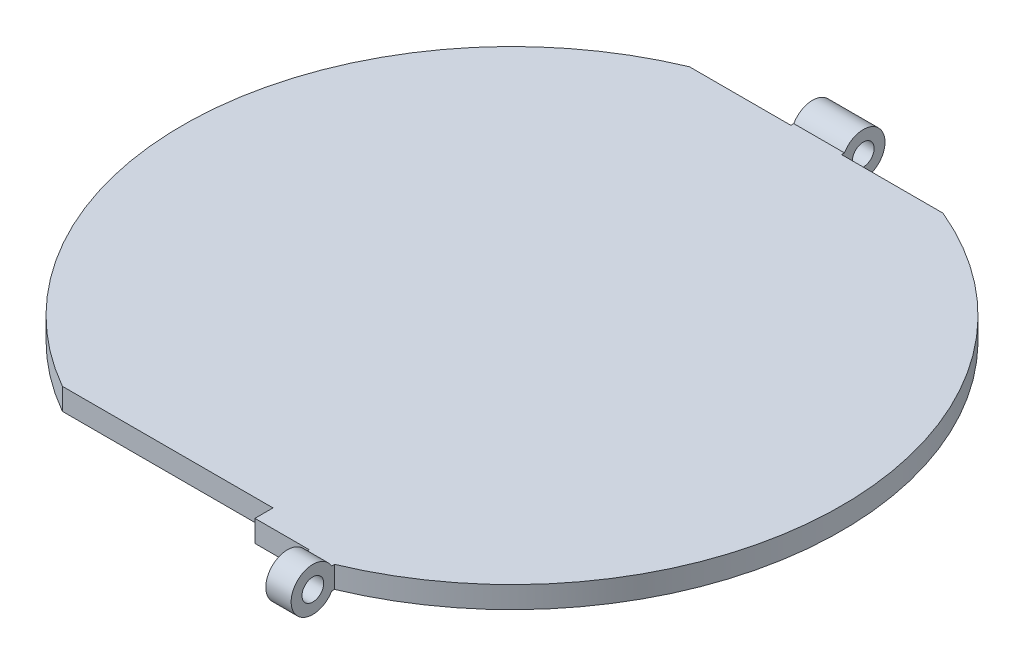
ISO-10303-21;
HEADER;
FILE_DESCRIPTION(('STEP AP214'),'2;1');
FILE_NAME('part.step','',(''),(''),'','','');
FILE_SCHEMA(('AUTOMOTIVE_DESIGN { 1 0 10303 214 1 1 1 1 }'));
ENDSEC;
DATA;
#1=APPLICATION_CONTEXT('core data for automotive mechanical design processes');
#2=APPLICATION_PROTOCOL_DEFINITION('international standard','automotive_design',2000,#1);
#3=PRODUCT_CONTEXT('',#1,'mechanical');
#4=PRODUCT('Part','Part','',(#3));
#5=PRODUCT_RELATED_PRODUCT_CATEGORY('part','',(#4));
#6=PRODUCT_DEFINITION_FORMATION('','',#4);
#7=PRODUCT_DEFINITION_CONTEXT('part definition',#1,'design');
#8=PRODUCT_DEFINITION('design','',#6,#7);
#9=PRODUCT_DEFINITION_SHAPE('','',#8);
#10=(LENGTH_UNIT() NAMED_UNIT(*) SI_UNIT(.MILLI.,.METRE.));
#11=(NAMED_UNIT(*) PLANE_ANGLE_UNIT() SI_UNIT($,.RADIAN.));
#12=(NAMED_UNIT(*) SI_UNIT($,.STERADIAN.) SOLID_ANGLE_UNIT());
#13=UNCERTAINTY_MEASURE_WITH_UNIT(LENGTH_MEASURE(1.E-05),#10,'distance_accuracy_value','');
#14=(GEOMETRIC_REPRESENTATION_CONTEXT(3) GLOBAL_UNCERTAINTY_ASSIGNED_CONTEXT((#13)) GLOBAL_UNIT_ASSIGNED_CONTEXT((#10,
#11,#12)) REPRESENTATION_CONTEXT('',''));
#15=CARTESIAN_POINT('',(0.,0.,0.));
#16=DIRECTION('',(0.,0.,1.));
#17=DIRECTION('',(1.,0.,0.));
#18=AXIS2_PLACEMENT_3D('',#15,#16,#17);
#19=CARTESIAN_POINT('',(0.,3.,0.));
#20=DIRECTION('',(0.,-1.,0.));
#21=DIRECTION('',(0.,0.,-1.));
#22=AXIS2_PLACEMENT_3D('',#19,#20,#21);
#23=CYLINDRICAL_SURFACE('',#22,45.5);
#24=DIRECTION('',(0.,-1.,0.));
#25=VECTOR('',#24,1.);
#26=CARTESIAN_POINT('',(-22.5831795812724,3.,39.5));
#27=LINE('',#26,#25);
#28=CARTESIAN_POINT('',(-22.5831795812724,0.,39.5));
#29=VERTEX_POINT('',#28);
#30=CARTESIAN_POINT('',(-22.5831795812724,3.,39.5));
#31=VERTEX_POINT('',#30);
#32=EDGE_CURVE('E51',#29,#31,#27,.F.);
#33=ORIENTED_EDGE('',*,*,#32,.T.);
#34=CARTESIAN_POINT('',(0.,3.,0.));
#35=DIRECTION('',(0.,1.,0.));
#36=DIRECTION('',(0.,0.,1.));
#37=AXIS2_PLACEMENT_3D('',#34,#35,#36);
#38=CIRCLE('',#37,45.5);
#39=CARTESIAN_POINT('',(-17.5,3.,-42.));
#40=VERTEX_POINT('',#39);
#41=EDGE_CURVE('E143',#40,#31,#38,.T.);
#42=ORIENTED_EDGE('',*,*,#41,.F.);
#43=DIRECTION('',(0.,-1.,0.));
#44=VECTOR('',#43,1.);
#45=CARTESIAN_POINT('',(-17.5,3.,-42.));
#46=LINE('',#45,#44);
#47=CARTESIAN_POINT('',(-17.5,0.,-42.));
#48=VERTEX_POINT('',#47);
#49=EDGE_CURVE('E164',#40,#48,#46,.T.);
#50=ORIENTED_EDGE('',*,*,#49,.T.);
#51=CARTESIAN_POINT('',(0.,0.,0.));
#52=DIRECTION('',(0.,1.,0.));
#53=DIRECTION('',(0.,0.,1.));
#54=AXIS2_PLACEMENT_3D('',#51,#52,#53);
#55=CIRCLE('',#54,45.5);
#56=EDGE_CURVE('E145',#48,#29,#55,.T.);
#57=ORIENTED_EDGE('',*,*,#56,.T.);
#58=EDGE_LOOP('',(#33,#42,#50,#57));
#59=FACE_BOUND('',#58,.T.);
#60=ADVANCED_FACE('F37',(#59),#23,.T.);
#61=CARTESIAN_POINT('',(-17.5,3.,42.));
#62=DIRECTION('',(0.,0.,-1.));
#63=DIRECTION('',(-1.,0.,0.));
#64=AXIS2_PLACEMENT_3D('',#61,#62,#63);
#65=PLANE('',#64);
#66=DIRECTION('',(0.,1.,0.));
#67=VECTOR('',#66,1.);
#68=CARTESIAN_POINT('',(6.5,3.,42.));
#69=LINE('',#68,#67);
#70=CARTESIAN_POINT('',(6.5,0.,42.));
#71=VERTEX_POINT('',#70);
#72=CARTESIAN_POINT('',(6.5,3.,42.));
#73=VERTEX_POINT('',#72);
#74=EDGE_CURVE('E137',#71,#73,#69,.T.);
#75=ORIENTED_EDGE('',*,*,#74,.F.);
#76=DIRECTION('',(1.,0.,0.));
#77=VECTOR('',#76,1.);
#78=CARTESIAN_POINT('',(-17.5,0.,42.));
#79=LINE('',#78,#77);
#80=CARTESIAN_POINT('',(14.,0.,42.));
#81=VERTEX_POINT('',#80);
#82=EDGE_CURVE('E166',#71,#81,#79,.T.);
#83=ORIENTED_EDGE('',*,*,#82,.T.);
#84=DIRECTION('',(0.,-1.,0.));
#85=VECTOR('',#84,1.);
#86=CARTESIAN_POINT('',(14.,6.5,42.));
#87=LINE('',#86,#85);
#88=CARTESIAN_POINT('',(14.,3.,42.));
#89=VERTEX_POINT('',#88);
#90=EDGE_CURVE('E182',#89,#81,#87,.T.);
#91=ORIENTED_EDGE('',*,*,#90,.F.);
#92=DIRECTION('',(1.,0.,0.));
#93=VECTOR('',#92,1.);
#94=CARTESIAN_POINT('',(-17.5,3.,42.));
#95=LINE('',#94,#93);
#96=EDGE_CURVE('E150',#73,#89,#95,.T.);
#97=ORIENTED_EDGE('',*,*,#96,.F.);
#98=EDGE_LOOP('',(#75,#83,#91,#97));
#99=FACE_BOUND('',#98,.T.);
#100=ADVANCED_FACE('F203',(#99),#65,.F.);
#101=CARTESIAN_POINT('',(0.,3.,0.));
#102=DIRECTION('',(0.,1.,0.));
#103=DIRECTION('',(0.,0.,1.));
#104=AXIS2_PLACEMENT_3D('',#101,#102,#103);
#105=PLANE('',#104);
#106=DIRECTION('',(1.,0.,0.));
#107=VECTOR('',#106,1.);
#108=CARTESIAN_POINT('',(0.,3.,39.5));
#109=LINE('',#108,#107);
#110=CARTESIAN_POINT('',(6.5,3.,39.5));
#111=VERTEX_POINT('',#110);
#112=EDGE_CURVE('E130',#31,#111,#109,.T.);
#113=ORIENTED_EDGE('',*,*,#112,.T.);
#114=DIRECTION('',(0.,0.,1.));
#115=VECTOR('',#114,1.);
#116=CARTESIAN_POINT('',(6.5,3.,0.));
#117=LINE('',#116,#115);
#118=EDGE_CURVE('E193',#111,#73,#117,.T.);
#119=ORIENTED_EDGE('',*,*,#118,.T.);
#120=ORIENTED_EDGE('',*,*,#96,.T.);
#121=DIRECTION('',(0.,0.,1.));
#122=VECTOR('',#121,1.);
#123=CARTESIAN_POINT('',(14.,3.,0.));
#124=LINE('',#123,#122);
#125=CARTESIAN_POINT('',(14.,3.,42.4019237886467));
#126=VERTEX_POINT('',#125);
#127=EDGE_CURVE('E211',#89,#126,#124,.T.);
#128=ORIENTED_EDGE('',*,*,#127,.T.);
#129=DIRECTION('',(1.,0.,0.));
#130=VECTOR('',#129,1.);
#131=CARTESIAN_POINT('',(-10.,3.,42.4019237886467));
#132=LINE('',#131,#130);
#133=CARTESIAN_POINT('',(17.5,3.,42.4019237886467));
#134=VERTEX_POINT('',#133);
#135=EDGE_CURVE('E158',#126,#134,#132,.T.);
#136=ORIENTED_EDGE('',*,*,#135,.T.);
#137=DIRECTION('',(0.,0.,1.));
#138=VECTOR('',#137,1.);
#139=CARTESIAN_POINT('',(17.5,3.,42.));
#140=LINE('',#139,#138);
#141=CARTESIAN_POINT('',(17.5,3.,42.));
#142=VERTEX_POINT('',#141);
#143=EDGE_CURVE('E229',#142,#134,#140,.T.);
#144=ORIENTED_EDGE('',*,*,#143,.F.);
#145=CARTESIAN_POINT('',(0.,3.,0.));
#146=DIRECTION('',(0.,1.,0.));
#147=DIRECTION('',(0.,0.,1.));
#148=AXIS2_PLACEMENT_3D('',#145,#146,#147);
#149=CIRCLE('',#148,45.5);
#150=CARTESIAN_POINT('',(17.5,3.,-42.));
#151=VERTEX_POINT('',#150);
#152=EDGE_CURVE('E153',#142,#151,#149,.T.);
#153=ORIENTED_EDGE('',*,*,#152,.T.);
#154=DIRECTION('',(1.,0.,0.));
#155=VECTOR('',#154,1.);
#156=CARTESIAN_POINT('',(0.,3.,-42.));
#157=LINE('',#156,#155);
#158=CARTESIAN_POINT('',(3.5,3.,-42.));
#159=VERTEX_POINT('',#158);
#160=EDGE_CURVE('E468',#159,#151,#157,.T.);
#161=ORIENTED_EDGE('',*,*,#160,.F.);
#162=DIRECTION('',(0.,0.,-1.));
#163=VECTOR('',#162,1.);
#164=CARTESIAN_POINT('',(3.5,3.,0.));
#165=LINE('',#164,#163);
#166=CARTESIAN_POINT('',(3.5,3.,-42.4019237886467));
#167=VERTEX_POINT('',#166);
#168=EDGE_CURVE('E457',#159,#167,#165,.T.);
#169=ORIENTED_EDGE('',*,*,#168,.T.);
#170=DIRECTION('',(1.,0.,0.));
#171=VECTOR('',#170,1.);
#172=CARTESIAN_POINT('',(-10.,3.,-42.4019237886467));
#173=LINE('',#172,#171);
#174=CARTESIAN_POINT('',(-3.5,3.,-42.4019237886467));
#175=VERTEX_POINT('',#174);
#176=EDGE_CURVE('E221',#175,#167,#173,.T.);
#177=ORIENTED_EDGE('',*,*,#176,.F.);
#178=DIRECTION('',(0.,0.,1.));
#179=VECTOR('',#178,1.);
#180=CARTESIAN_POINT('',(-3.5,3.,0.));
#181=LINE('',#180,#179);
#182=CARTESIAN_POINT('',(-3.5,3.,-42.));
#183=VERTEX_POINT('',#182);
#184=EDGE_CURVE('E59',#175,#183,#181,.T.);
#185=ORIENTED_EDGE('',*,*,#184,.T.);
#186=DIRECTION('',(-1.,0.,0.));
#187=VECTOR('',#186,1.);
#188=CARTESIAN_POINT('',(-17.5,3.,-42.));
#189=LINE('',#188,#187);
#190=EDGE_CURVE('E148',#183,#40,#189,.T.);
#191=ORIENTED_EDGE('',*,*,#190,.T.);
#192=ORIENTED_EDGE('',*,*,#41,.T.);
#193=EDGE_LOOP('',(#113,#119,#120,#128,#136,#144,#153,#161,#169,#177,#185,#191,#192));
#194=FACE_BOUND('',#193,.T.);
#195=ADVANCED_FACE('F147',(#194),#105,.T.);
#196=CARTESIAN_POINT('',(0.,0.,0.));
#197=DIRECTION('',(0.,1.,0.));
#198=DIRECTION('',(0.,0.,1.));
#199=AXIS2_PLACEMENT_3D('',#196,#197,#198);
#200=PLANE('',#199);
#201=DIRECTION('',(0.,0.,1.));
#202=VECTOR('',#201,1.);
#203=CARTESIAN_POINT('',(6.5,0.,0.));
#204=LINE('',#203,#202);
#205=CARTESIAN_POINT('',(6.5,0.,39.5));
#206=VERTEX_POINT('',#205);
#207=EDGE_CURVE('E11',#206,#71,#204,.T.);
#208=ORIENTED_EDGE('',*,*,#207,.F.);
#209=DIRECTION('',(1.,0.,0.));
#210=VECTOR('',#209,1.);
#211=CARTESIAN_POINT('',(0.,0.,39.5));
#212=LINE('',#211,#210);
#213=EDGE_CURVE('E44',#29,#206,#212,.T.);
#214=ORIENTED_EDGE('',*,*,#213,.F.);
#215=ORIENTED_EDGE('',*,*,#56,.F.);
#216=DIRECTION('',(-1.,0.,0.));
#217=VECTOR('',#216,1.);
#218=CARTESIAN_POINT('',(-17.5,0.,-42.));
#219=LINE('',#218,#217);
#220=CARTESIAN_POINT('',(-3.5,0.,-42.));
#221=VERTEX_POINT('',#220);
#222=EDGE_CURVE('E151',#221,#48,#219,.T.);
#223=ORIENTED_EDGE('',*,*,#222,.F.);
#224=DIRECTION('',(0.,0.,1.));
#225=VECTOR('',#224,1.);
#226=CARTESIAN_POINT('',(-3.5,0.,0.));
#227=LINE('',#226,#225);
#228=CARTESIAN_POINT('',(-3.5,0.,-42.4019237886467));
#229=VERTEX_POINT('',#228);
#230=EDGE_CURVE('E213',#229,#221,#227,.T.);
#231=ORIENTED_EDGE('',*,*,#230,.F.);
#232=DIRECTION('',(1.,0.,0.));
#233=VECTOR('',#232,1.);
#234=CARTESIAN_POINT('',(-10.,0.,-42.4019237886467));
#235=LINE('',#234,#233);
#236=CARTESIAN_POINT('',(3.5,0.,-42.4019237886467));
#237=VERTEX_POINT('',#236);
#238=EDGE_CURVE('E220',#229,#237,#235,.T.);
#239=ORIENTED_EDGE('',*,*,#238,.T.);
#240=DIRECTION('',(0.,0.,-1.));
#241=VECTOR('',#240,1.);
#242=CARTESIAN_POINT('',(3.5,0.,0.));
#243=LINE('',#242,#241);
#244=CARTESIAN_POINT('',(3.5,0.,-42.));
#245=VERTEX_POINT('',#244);
#246=EDGE_CURVE('E177',#245,#237,#243,.T.);
#247=ORIENTED_EDGE('',*,*,#246,.F.);
#248=DIRECTION('',(1.,0.,0.));
#249=VECTOR('',#248,1.);
#250=CARTESIAN_POINT('',(0.,0.,-42.));
#251=LINE('',#250,#249);
#252=CARTESIAN_POINT('',(17.5,0.,-42.));
#253=VERTEX_POINT('',#252);
#254=EDGE_CURVE('E459',#245,#253,#251,.T.);
#255=ORIENTED_EDGE('',*,*,#254,.T.);
#256=CARTESIAN_POINT('',(0.,0.,0.));
#257=DIRECTION('',(0.,1.,0.));
#258=DIRECTION('',(0.,0.,1.));
#259=AXIS2_PLACEMENT_3D('',#256,#257,#258);
#260=CIRCLE('',#259,45.5);
#261=CARTESIAN_POINT('',(17.5,0.,42.));
#262=VERTEX_POINT('',#261);
#263=EDGE_CURVE('E155',#262,#253,#260,.T.);
#264=ORIENTED_EDGE('',*,*,#263,.F.);
#265=DIRECTION('',(0.,0.,-1.));
#266=VECTOR('',#265,1.);
#267=CARTESIAN_POINT('',(17.5,0.,42.));
#268=LINE('',#267,#266);
#269=CARTESIAN_POINT('',(17.5,0.,42.4019237886467));
#270=VERTEX_POINT('',#269);
#271=EDGE_CURVE('E235',#270,#262,#268,.T.);
#272=ORIENTED_EDGE('',*,*,#271,.F.);
#273=DIRECTION('',(1.,0.,0.));
#274=VECTOR('',#273,1.);
#275=CARTESIAN_POINT('',(-10.,0.,42.4019237886467));
#276=LINE('',#275,#274);
#277=CARTESIAN_POINT('',(14.,0.,42.4019237886467));
#278=VERTEX_POINT('',#277);
#279=EDGE_CURVE('E167',#278,#270,#276,.T.);
#280=ORIENTED_EDGE('',*,*,#279,.F.);
#281=DIRECTION('',(0.,0.,1.));
#282=VECTOR('',#281,1.);
#283=CARTESIAN_POINT('',(14.,0.,0.));
#284=LINE('',#283,#282);
#285=EDGE_CURVE('E199',#81,#278,#284,.T.);
#286=ORIENTED_EDGE('',*,*,#285,.F.);
#287=ORIENTED_EDGE('',*,*,#82,.F.);
#288=EDGE_LOOP('',(#208,#214,#215,#223,#231,#239,#247,#255,#264,#272,#280,#286,#287));
#289=FACE_BOUND('',#288,.T.);
#290=ADVANCED_FACE('F196',(#289),#200,.F.);
#291=CARTESIAN_POINT('',(-10.,1.5,-45.));
#292=DIRECTION('',(1.,0.,0.));
#293=DIRECTION('',(0.,0.,-1.));
#294=AXIS2_PLACEMENT_3D('',#291,#292,#293);
#295=CYLINDRICAL_SURFACE('',#294,3.);
#296=CARTESIAN_POINT('',(3.5,1.5,-45.));
#297=DIRECTION('',(1.,0.,0.));
#298=DIRECTION('',(0.,0.,-1.));
#299=AXIS2_PLACEMENT_3D('',#296,#297,#298);
#300=CIRCLE('',#299,3.);
#301=EDGE_CURVE('E467',#237,#167,#300,.T.);
#302=ORIENTED_EDGE('',*,*,#301,.F.);
#303=ORIENTED_EDGE('',*,*,#238,.F.);
#304=CARTESIAN_POINT('',(-3.5,1.5,-45.));
#305=DIRECTION('',(-1.,0.,0.));
#306=DIRECTION('',(0.,0.,1.));
#307=AXIS2_PLACEMENT_3D('',#304,#305,#306);
#308=CIRCLE('',#307,3.);
#309=EDGE_CURVE('E186',#175,#229,#308,.T.);
#310=ORIENTED_EDGE('',*,*,#309,.F.);
#311=ORIENTED_EDGE('',*,*,#176,.T.);
#312=EDGE_LOOP('',(#302,#303,#310,#311));
#313=FACE_BOUND('',#312,.T.);
#314=ADVANCED_FACE('F257',(#313),#295,.T.);
#315=CARTESIAN_POINT('',(-10.,1.5,-45.));
#316=DIRECTION('',(1.,0.,0.));
#317=DIRECTION('',(0.,0.,-1.));
#318=AXIS2_PLACEMENT_3D('',#315,#316,#317);
#319=CYLINDRICAL_SURFACE('',#318,1.5);
#320=CARTESIAN_POINT('',(-3.5,1.5,-45.));
#321=DIRECTION('',(-1.,0.,0.));
#322=DIRECTION('',(0.,0.,1.));
#323=AXIS2_PLACEMENT_3D('',#320,#321,#322);
#324=CIRCLE('',#323,1.5);
#325=CARTESIAN_POINT('',(-3.5,1.5,-43.5));
#326=VERTEX_POINT('',#325);
#327=EDGE_CURVE('E183',#326,#326,#324,.T.);
#328=ORIENTED_EDGE('',*,*,#327,.T.);
#329=EDGE_LOOP('',(#328));
#330=FACE_BOUND('',#329,.T.);
#331=CARTESIAN_POINT('',(3.5,1.5,-45.));
#332=DIRECTION('',(1.,0.,0.));
#333=DIRECTION('',(0.,0.,-1.));
#334=AXIS2_PLACEMENT_3D('',#331,#332,#333);
#335=CIRCLE('',#334,1.5);
#336=CARTESIAN_POINT('',(3.5,1.5,-46.5));
#337=VERTEX_POINT('',#336);
#338=EDGE_CURVE('E451',#337,#337,#335,.T.);
#339=ORIENTED_EDGE('',*,*,#338,.T.);
#340=EDGE_LOOP('',(#339));
#341=FACE_BOUND('',#340,.T.);
#342=ADVANCED_FACE('F248',(#330,#341),#319,.F.);
#343=CARTESIAN_POINT('',(-10.,1.5,45.));
#344=DIRECTION('',(1.,0.,0.));
#345=DIRECTION('',(0.,0.,-1.));
#346=AXIS2_PLACEMENT_3D('',#343,#344,#345);
#347=CYLINDRICAL_SURFACE('',#346,3.);
#348=ORIENTED_EDGE('',*,*,#135,.F.);
#349=CARTESIAN_POINT('',(14.,1.5,45.));
#350=DIRECTION('',(-1.,0.,0.));
#351=DIRECTION('',(0.,0.,1.));
#352=AXIS2_PLACEMENT_3D('',#349,#350,#351);
#353=CIRCLE('',#352,3.);
#354=EDGE_CURVE('E181',#126,#278,#353,.F.);
#355=ORIENTED_EDGE('',*,*,#354,.T.);
#356=ORIENTED_EDGE('',*,*,#279,.T.);
#357=CARTESIAN_POINT('',(17.5,1.5,45.));
#358=DIRECTION('',(1.,0.,0.));
#359=DIRECTION('',(0.,0.,-1.));
#360=AXIS2_PLACEMENT_3D('',#357,#358,#359);
#361=CIRCLE('',#360,3.);
#362=EDGE_CURVE('E232',#134,#270,#361,.T.);
#363=ORIENTED_EDGE('',*,*,#362,.F.);
#364=EDGE_LOOP('',(#348,#355,#356,#363));
#365=FACE_BOUND('',#364,.T.);
#366=ADVANCED_FACE('F245',(#365),#347,.T.);
#367=CARTESIAN_POINT('',(-10.,1.5,45.));
#368=DIRECTION('',(1.,0.,0.));
#369=DIRECTION('',(0.,0.,-1.));
#370=AXIS2_PLACEMENT_3D('',#367,#368,#369);
#371=CYLINDRICAL_SURFACE('',#370,1.5);
#372=CARTESIAN_POINT('',(17.5,1.5,45.));
#373=DIRECTION('',(1.,0.,0.));
#374=DIRECTION('',(0.,0.,-1.));
#375=AXIS2_PLACEMENT_3D('',#372,#373,#374);
#376=CIRCLE('',#375,1.5);
#377=CARTESIAN_POINT('',(17.5,1.5,43.5));
#378=VERTEX_POINT('',#377);
#379=EDGE_CURVE('E224',#378,#378,#376,.T.);
#380=ORIENTED_EDGE('',*,*,#379,.T.);
#381=EDGE_LOOP('',(#380));
#382=FACE_BOUND('',#381,.T.);
#383=CARTESIAN_POINT('',(14.,1.5,45.));
#384=DIRECTION('',(-1.,0.,0.));
#385=DIRECTION('',(0.,0.,1.));
#386=AXIS2_PLACEMENT_3D('',#383,#384,#385);
#387=CIRCLE('',#386,1.5);
#388=CARTESIAN_POINT('',(14.,1.5,46.5));
#389=VERTEX_POINT('',#388);
#390=EDGE_CURVE('E178',#389,#389,#387,.F.);
#391=ORIENTED_EDGE('',*,*,#390,.F.);
#392=EDGE_LOOP('',(#391));
#393=FACE_BOUND('',#392,.T.);
#394=ADVANCED_FACE('F247',(#382,#393),#371,.F.);
#395=CARTESIAN_POINT('',(-17.5,3.,-42.));
#396=DIRECTION('',(0.,0.,1.));
#397=DIRECTION('',(1.,0.,0.));
#398=AXIS2_PLACEMENT_3D('',#395,#396,#397);
#399=PLANE('',#398);
#400=ORIENTED_EDGE('',*,*,#190,.F.);
#401=DIRECTION('',(0.,1.,0.));
#402=VECTOR('',#401,1.);
#403=CARTESIAN_POINT('',(-3.5,-2.5,-42.));
#404=LINE('',#403,#402);
#405=EDGE_CURVE('E187',#221,#183,#404,.T.);
#406=ORIENTED_EDGE('',*,*,#405,.F.);
#407=ORIENTED_EDGE('',*,*,#222,.T.);
#408=ORIENTED_EDGE('',*,*,#49,.F.);
#409=EDGE_LOOP('',(#400,#406,#407,#408));
#410=FACE_BOUND('',#409,.T.);
#411=ADVANCED_FACE('F254',(#410),#399,.F.);
#412=CARTESIAN_POINT('',(0.,3.,0.));
#413=DIRECTION('',(0.,-1.,0.));
#414=DIRECTION('',(0.,0.,-1.));
#415=AXIS2_PLACEMENT_3D('',#412,#413,#414);
#416=CYLINDRICAL_SURFACE('',#415,45.5);
#417=ORIENTED_EDGE('',*,*,#263,.T.);
#418=DIRECTION('',(0.,-1.,0.));
#419=VECTOR('',#418,1.);
#420=CARTESIAN_POINT('',(17.5,3.,-42.));
#421=LINE('',#420,#419);
#422=EDGE_CURVE('E172',#151,#253,#421,.T.);
#423=ORIENTED_EDGE('',*,*,#422,.F.);
#424=ORIENTED_EDGE('',*,*,#152,.F.);
#425=DIRECTION('',(0.,-1.,0.));
#426=VECTOR('',#425,1.);
#427=CARTESIAN_POINT('',(17.5,3.,42.));
#428=LINE('',#427,#426);
#429=EDGE_CURVE('E174',#142,#262,#428,.T.);
#430=ORIENTED_EDGE('',*,*,#429,.T.);
#431=EDGE_LOOP('',(#417,#423,#424,#430));
#432=FACE_BOUND('',#431,.T.);
#433=ADVANCED_FACE('F271',(#432),#416,.T.);
#434=CARTESIAN_POINT('',(17.5,1.5,45.));
#435=DIRECTION('',(1.,0.,0.));
#436=DIRECTION('',(0.,0.,-1.));
#437=AXIS2_PLACEMENT_3D('',#434,#435,#436);
#438=PLANE('',#437);
#439=ORIENTED_EDGE('',*,*,#429,.F.);
#440=ORIENTED_EDGE('',*,*,#143,.T.);
#441=ORIENTED_EDGE('',*,*,#362,.T.);
#442=ORIENTED_EDGE('',*,*,#271,.T.);
#443=EDGE_LOOP('',(#439,#440,#441,#442));
#444=FACE_BOUND('',#443,.T.);
#445=ORIENTED_EDGE('',*,*,#379,.F.);
#446=EDGE_LOOP('',(#445));
#447=FACE_BOUND('',#446,.T.);
#448=ADVANCED_FACE('F242',(#444,#447),#438,.T.);
#449=CARTESIAN_POINT('',(14.,0.,0.));
#450=DIRECTION('',(-1.,0.,0.));
#451=DIRECTION('',(0.,0.,1.));
#452=AXIS2_PLACEMENT_3D('',#449,#450,#451);
#453=PLANE('',#452);
#454=ORIENTED_EDGE('',*,*,#90,.T.);
#455=ORIENTED_EDGE('',*,*,#285,.T.);
#456=ORIENTED_EDGE('',*,*,#354,.F.);
#457=ORIENTED_EDGE('',*,*,#127,.F.);
#458=EDGE_LOOP('',(#454,#455,#456,#457));
#459=FACE_BOUND('',#458,.T.);
#460=ORIENTED_EDGE('',*,*,#390,.T.);
#461=EDGE_LOOP('',(#460));
#462=FACE_BOUND('',#461,.T.);
#463=ADVANCED_FACE('F207',(#459,#462),#453,.T.);
#464=CARTESIAN_POINT('',(-3.5,0.,0.));
#465=DIRECTION('',(-1.,0.,0.));
#466=DIRECTION('',(0.,0.,1.));
#467=AXIS2_PLACEMENT_3D('',#464,#465,#466);
#468=PLANE('',#467);
#469=ORIENTED_EDGE('',*,*,#309,.T.);
#470=ORIENTED_EDGE('',*,*,#230,.T.);
#471=ORIENTED_EDGE('',*,*,#405,.T.);
#472=ORIENTED_EDGE('',*,*,#184,.F.);
#473=EDGE_LOOP('',(#469,#470,#471,#472));
#474=FACE_BOUND('',#473,.T.);
#475=ORIENTED_EDGE('',*,*,#327,.F.);
#476=EDGE_LOOP('',(#475));
#477=FACE_BOUND('',#476,.T.);
#478=ADVANCED_FACE('F293',(#474,#477),#468,.T.);
#479=CARTESIAN_POINT('',(3.5,5.08958026071778,-42.));
#480=DIRECTION('',(0.,0.,1.));
#481=DIRECTION('',(1.,0.,0.));
#482=AXIS2_PLACEMENT_3D('',#479,#480,#481);
#483=PLANE('',#482);
#484=ORIENTED_EDGE('',*,*,#160,.T.);
#485=ORIENTED_EDGE('',*,*,#422,.T.);
#486=ORIENTED_EDGE('',*,*,#254,.F.);
#487=DIRECTION('',(0.,-1.,0.));
#488=VECTOR('',#487,1.);
#489=CARTESIAN_POINT('',(3.5,5.08958026071778,-42.));
#490=LINE('',#489,#488);
#491=EDGE_CURVE('E454',#159,#245,#490,.T.);
#492=ORIENTED_EDGE('',*,*,#491,.F.);
#493=EDGE_LOOP('',(#484,#485,#486,#492));
#494=FACE_BOUND('',#493,.T.);
#495=ADVANCED_FACE('F297',(#494),#483,.F.);
#496=CARTESIAN_POINT('',(3.5,0.,0.));
#497=DIRECTION('',(1.,0.,0.));
#498=DIRECTION('',(0.,0.,-1.));
#499=AXIS2_PLACEMENT_3D('',#496,#497,#498);
#500=PLANE('',#499);
#501=ORIENTED_EDGE('',*,*,#338,.F.);
#502=EDGE_LOOP('',(#501));
#503=FACE_BOUND('',#502,.T.);
#504=ORIENTED_EDGE('',*,*,#491,.T.);
#505=ORIENTED_EDGE('',*,*,#246,.T.);
#506=ORIENTED_EDGE('',*,*,#301,.T.);
#507=ORIENTED_EDGE('',*,*,#168,.F.);
#508=EDGE_LOOP('',(#504,#505,#506,#507));
#509=FACE_BOUND('',#508,.T.);
#510=ADVANCED_FACE('F302',(#503,#509),#500,.T.);
#511=CARTESIAN_POINT('',(-45.501,7.5,39.5));
#512=DIRECTION('',(0.,0.,1.));
#513=DIRECTION('',(1.,0.,0.));
#514=AXIS2_PLACEMENT_3D('',#511,#512,#513);
#515=PLANE('',#514);
#516=ORIENTED_EDGE('',*,*,#32,.F.);
#517=ORIENTED_EDGE('',*,*,#213,.T.);
#518=DIRECTION('',(0.,-1.,0.));
#519=VECTOR('',#518,1.);
#520=CARTESIAN_POINT('',(6.5,7.5,39.5));
#521=LINE('',#520,#519);
#522=EDGE_CURVE('E133',#111,#206,#521,.T.);
#523=ORIENTED_EDGE('',*,*,#522,.F.);
#524=ORIENTED_EDGE('',*,*,#112,.F.);
#525=EDGE_LOOP('',(#516,#517,#523,#524));
#526=FACE_BOUND('',#525,.T.);
#527=ADVANCED_FACE('F131',(#526),#515,.T.);
#528=CARTESIAN_POINT('',(6.5,0.,0.));
#529=DIRECTION('',(-1.,0.,0.));
#530=DIRECTION('',(0.,0.,1.));
#531=AXIS2_PLACEMENT_3D('',#528,#529,#530);
#532=PLANE('',#531);
#533=ORIENTED_EDGE('',*,*,#522,.T.);
#534=ORIENTED_EDGE('',*,*,#207,.T.);
#535=ORIENTED_EDGE('',*,*,#74,.T.);
#536=ORIENTED_EDGE('',*,*,#118,.F.);
#537=EDGE_LOOP('',(#533,#534,#535,#536));
#538=FACE_BOUND('',#537,.T.);
#539=ADVANCED_FACE('F191',(#538),#532,.T.);
#540=CLOSED_SHELL('',(#60,#100,#195,#290,#314,#342,#366,#394,#411,#433,#448,#463,#478,#495,#510,
#527,#539));
#541=MANIFOLD_SOLID_BREP('B2',#540);
#542=ADVANCED_BREP_SHAPE_REPRESENTATION('',(#18,#541),#14);
#543=SHAPE_DEFINITION_REPRESENTATION(#9,#542);
ENDSEC;
END-ISO-10303-21;
